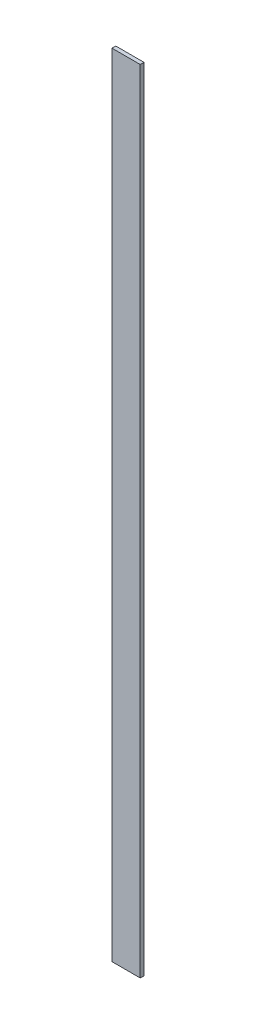
ISO-10303-21;
HEADER;
FILE_DESCRIPTION(('STEP AP214'),'2;1');
FILE_NAME('part.step','',(''),(''),'','','');
FILE_SCHEMA(('AUTOMOTIVE_DESIGN { 1 0 10303 214 1 1 1 1 }'));
ENDSEC;
DATA;
#1=APPLICATION_CONTEXT('core data for automotive mechanical design processes');
#2=APPLICATION_PROTOCOL_DEFINITION('international standard','automotive_design',2000,#1);
#3=PRODUCT_CONTEXT('',#1,'mechanical');
#4=PRODUCT('Part','Part','',(#3));
#5=PRODUCT_RELATED_PRODUCT_CATEGORY('part','',(#4));
#6=PRODUCT_DEFINITION_FORMATION('','',#4);
#7=PRODUCT_DEFINITION_CONTEXT('part definition',#1,'design');
#8=PRODUCT_DEFINITION('design','',#6,#7);
#9=PRODUCT_DEFINITION_SHAPE('','',#8);
#10=(LENGTH_UNIT() NAMED_UNIT(*) SI_UNIT(.MILLI.,.METRE.));
#11=(NAMED_UNIT(*) PLANE_ANGLE_UNIT() SI_UNIT($,.RADIAN.));
#12=(NAMED_UNIT(*) SI_UNIT($,.STERADIAN.) SOLID_ANGLE_UNIT());
#13=UNCERTAINTY_MEASURE_WITH_UNIT(LENGTH_MEASURE(1.E-05),#10,'distance_accuracy_value','');
#14=(GEOMETRIC_REPRESENTATION_CONTEXT(3) GLOBAL_UNCERTAINTY_ASSIGNED_CONTEXT((#13)) GLOBAL_UNIT_ASSIGNED_CONTEXT((#10,
#11,#12)) REPRESENTATION_CONTEXT('',''));
#15=CARTESIAN_POINT('',(0.,0.,0.));
#16=DIRECTION('',(0.,0.,1.));
#17=DIRECTION('',(1.,0.,0.));
#18=AXIS2_PLACEMENT_3D('',#15,#16,#17);
#19=CARTESIAN_POINT('',(-1444.55117946943,2477.10008592118,4.));
#20=DIRECTION('',(1.,0.,0.));
#21=DIRECTION('',(0.,1.,0.));
#22=AXIS2_PLACEMENT_3D('',#19,#20,#21);
#23=PLANE('',#22);
#24=DIRECTION('',(0.,-1.,0.));
#25=VECTOR('',#24,1.);
#26=CARTESIAN_POINT('',(-1444.55117946943,2477.10008592118,0.));
#27=LINE('',#26,#25);
#28=CARTESIAN_POINT('',(-1444.55117946943,2477.10008592118,0.));
#29=VERTEX_POINT('',#28);
#30=CARTESIAN_POINT('',(-1444.55117946943,1637.10008592118,0.));
#31=VERTEX_POINT('',#30);
#32=EDGE_CURVE('E98',#29,#31,#27,.T.);
#33=ORIENTED_EDGE('',*,*,#32,.T.);
#34=DIRECTION('',(0.,0.,-1.));
#35=VECTOR('',#34,1.);
#36=CARTESIAN_POINT('',(-1444.55117946943,1637.10008592118,4.));
#37=LINE('',#36,#35);
#38=CARTESIAN_POINT('',(-1444.55117946943,1637.10008592118,4.));
#39=VERTEX_POINT('',#38);
#40=EDGE_CURVE('E11',#39,#31,#37,.T.);
#41=ORIENTED_EDGE('',*,*,#40,.F.);
#42=DIRECTION('',(0.,-1.,0.));
#43=VECTOR('',#42,1.);
#44=CARTESIAN_POINT('',(-1444.55117946943,2477.10008592118,4.));
#45=LINE('',#44,#43);
#46=CARTESIAN_POINT('',(-1444.55117946943,2477.10008592118,4.));
#47=VERTEX_POINT('',#46);
#48=EDGE_CURVE('E86',#47,#39,#45,.T.);
#49=ORIENTED_EDGE('',*,*,#48,.F.);
#50=DIRECTION('',(0.,0.,-1.));
#51=VECTOR('',#50,1.);
#52=CARTESIAN_POINT('',(-1444.55117946943,2477.10008592118,4.));
#53=LINE('',#52,#51);
#54=EDGE_CURVE('E94',#47,#29,#53,.T.);
#55=ORIENTED_EDGE('',*,*,#54,.T.);
#56=EDGE_LOOP('',(#33,#41,#49,#55));
#57=FACE_BOUND('',#56,.T.);
#58=ADVANCED_FACE('F35',(#57),#23,.F.);
#59=CARTESIAN_POINT('',(-1444.55117946943,1637.10008592118,4.));
#60=DIRECTION('',(0.,1.,0.));
#61=DIRECTION('',(0.,0.,1.));
#62=AXIS2_PLACEMENT_3D('',#59,#60,#61);
#63=PLANE('',#62);
#64=DIRECTION('',(1.,0.,0.));
#65=VECTOR('',#64,1.);
#66=CARTESIAN_POINT('',(-1444.55117946943,1637.10008592118,0.));
#67=LINE('',#66,#65);
#68=CARTESIAN_POINT('',(-1414.55117946943,1637.10008592118,0.));
#69=VERTEX_POINT('',#68);
#70=EDGE_CURVE('E90',#31,#69,#67,.T.);
#71=ORIENTED_EDGE('',*,*,#70,.T.);
#72=DIRECTION('',(0.,0.,-1.));
#73=VECTOR('',#72,1.);
#74=CARTESIAN_POINT('',(-1414.55117946943,1637.10008592118,4.));
#75=LINE('',#74,#73);
#76=CARTESIAN_POINT('',(-1414.55117946943,1637.10008592118,4.));
#77=VERTEX_POINT('',#76);
#78=EDGE_CURVE('E43',#77,#69,#75,.T.);
#79=ORIENTED_EDGE('',*,*,#78,.F.);
#80=DIRECTION('',(1.,0.,0.));
#81=VECTOR('',#80,1.);
#82=CARTESIAN_POINT('',(-1444.55117946943,1637.10008592118,4.));
#83=LINE('',#82,#81);
#84=EDGE_CURVE('E81',#39,#77,#83,.T.);
#85=ORIENTED_EDGE('',*,*,#84,.F.);
#86=ORIENTED_EDGE('',*,*,#40,.T.);
#87=EDGE_LOOP('',(#71,#79,#85,#86));
#88=FACE_BOUND('',#87,.T.);
#89=ADVANCED_FACE('F89',(#88),#63,.F.);
#90=CARTESIAN_POINT('',(-1414.55117946943,2477.10008592118,4.));
#91=DIRECTION('',(-1.,0.,0.));
#92=DIRECTION('',(0.,0.,1.));
#93=AXIS2_PLACEMENT_3D('',#90,#91,#92);
#94=PLANE('',#93);
#95=DIRECTION('',(0.,1.,0.));
#96=VECTOR('',#95,1.);
#97=CARTESIAN_POINT('',(-1414.55117946943,2477.10008592118,0.));
#98=LINE('',#97,#96);
#99=CARTESIAN_POINT('',(-1414.55117946943,2477.10008592118,0.));
#100=VERTEX_POINT('',#99);
#101=EDGE_CURVE('E68',#69,#100,#98,.T.);
#102=ORIENTED_EDGE('',*,*,#101,.T.);
#103=DIRECTION('',(0.,0.,-1.));
#104=VECTOR('',#103,1.);
#105=CARTESIAN_POINT('',(-1414.55117946943,2477.10008592118,4.));
#106=LINE('',#105,#104);
#107=CARTESIAN_POINT('',(-1414.55117946943,2477.10008592118,4.));
#108=VERTEX_POINT('',#107);
#109=EDGE_CURVE('E91',#108,#100,#106,.T.);
#110=ORIENTED_EDGE('',*,*,#109,.F.);
#111=DIRECTION('',(0.,1.,0.));
#112=VECTOR('',#111,1.);
#113=CARTESIAN_POINT('',(-1414.55117946943,2477.10008592118,4.));
#114=LINE('',#113,#112);
#115=EDGE_CURVE('E84',#77,#108,#114,.T.);
#116=ORIENTED_EDGE('',*,*,#115,.F.);
#117=ORIENTED_EDGE('',*,*,#78,.T.);
#118=EDGE_LOOP('',(#102,#110,#116,#117));
#119=FACE_BOUND('',#118,.T.);
#120=ADVANCED_FACE('F92',(#119),#94,.F.);
#121=CARTESIAN_POINT('',(-1444.55117946943,2477.10008592118,4.));
#122=DIRECTION('',(0.,-1.,0.));
#123=DIRECTION('',(0.,0.,-1.));
#124=AXIS2_PLACEMENT_3D('',#121,#122,#123);
#125=PLANE('',#124);
#126=DIRECTION('',(-1.,0.,0.));
#127=VECTOR('',#126,1.);
#128=CARTESIAN_POINT('',(-1444.55117946943,2477.10008592118,0.));
#129=LINE('',#128,#127);
#130=EDGE_CURVE('E74',#100,#29,#129,.T.);
#131=ORIENTED_EDGE('',*,*,#130,.T.);
#132=ORIENTED_EDGE('',*,*,#54,.F.);
#133=DIRECTION('',(-1.,0.,0.));
#134=VECTOR('',#133,1.);
#135=CARTESIAN_POINT('',(-1444.55117946943,2477.10008592118,4.));
#136=LINE('',#135,#134);
#137=EDGE_CURVE('E51',#108,#47,#136,.T.);
#138=ORIENTED_EDGE('',*,*,#137,.F.);
#139=ORIENTED_EDGE('',*,*,#109,.T.);
#140=EDGE_LOOP('',(#131,#132,#138,#139));
#141=FACE_BOUND('',#140,.T.);
#142=ADVANCED_FACE('F105',(#141),#125,.F.);
#143=CARTESIAN_POINT('',(0.,0.,4.));
#144=DIRECTION('',(0.,0.,1.));
#145=DIRECTION('',(1.,0.,0.));
#146=AXIS2_PLACEMENT_3D('',#143,#144,#145);
#147=PLANE('',#146);
#148=ORIENTED_EDGE('',*,*,#48,.T.);
#149=ORIENTED_EDGE('',*,*,#84,.T.);
#150=ORIENTED_EDGE('',*,*,#115,.T.);
#151=ORIENTED_EDGE('',*,*,#137,.T.);
#152=EDGE_LOOP('',(#148,#149,#150,#151));
#153=FACE_BOUND('',#152,.T.);
#154=ADVANCED_FACE('F82',(#153),#147,.T.);
#155=CARTESIAN_POINT('',(0.,0.,0.));
#156=DIRECTION('',(0.,0.,1.));
#157=DIRECTION('',(1.,0.,0.));
#158=AXIS2_PLACEMENT_3D('',#155,#156,#157);
#159=PLANE('',#158);
#160=ORIENTED_EDGE('',*,*,#32,.F.);
#161=ORIENTED_EDGE('',*,*,#130,.F.);
#162=ORIENTED_EDGE('',*,*,#101,.F.);
#163=ORIENTED_EDGE('',*,*,#70,.F.);
#164=EDGE_LOOP('',(#160,#161,#162,#163));
#165=FACE_BOUND('',#164,.T.);
#166=ADVANCED_FACE('F108',(#165),#159,.F.);
#167=CLOSED_SHELL('',(#58,#89,#120,#142,#154,#166));
#168=MANIFOLD_SOLID_BREP('B2',#167);
#169=ADVANCED_BREP_SHAPE_REPRESENTATION('',(#18,#168),#14);
#170=SHAPE_DEFINITION_REPRESENTATION(#9,#169);
ENDSEC;
END-ISO-10303-21;
